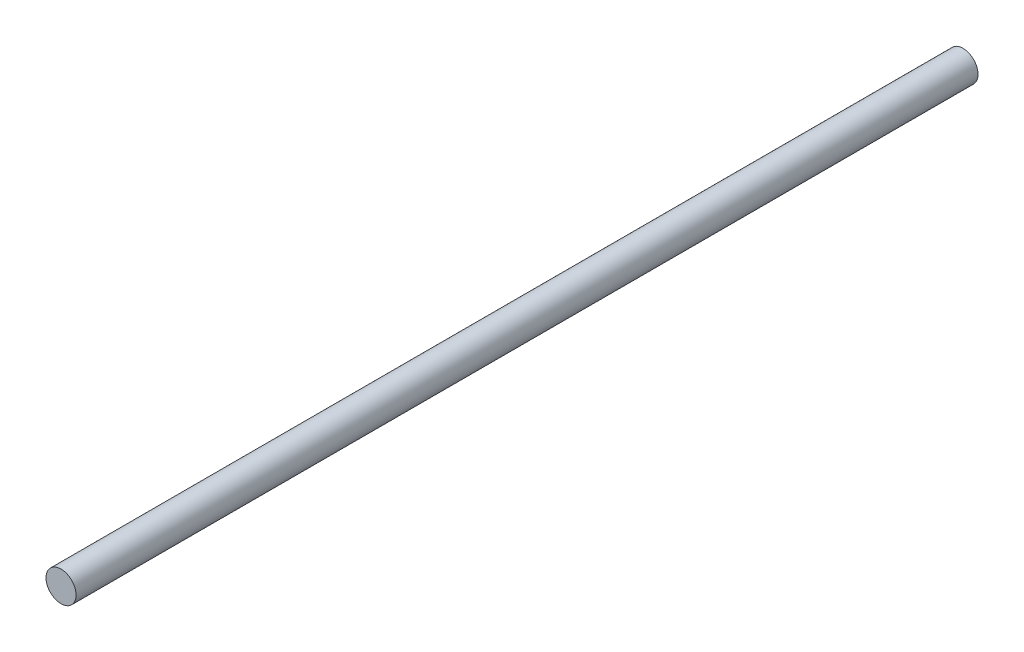
ISO-10303-21;
HEADER;
FILE_DESCRIPTION(('STEP AP214'),'2;1');
FILE_NAME('part.step','',(''),(''),'','','');
FILE_SCHEMA(('AUTOMOTIVE_DESIGN { 1 0 10303 214 1 1 1 1 }'));
ENDSEC;
DATA;
#1=APPLICATION_CONTEXT('core data for automotive mechanical design processes');
#2=APPLICATION_PROTOCOL_DEFINITION('international standard','automotive_design',2000,#1);
#3=PRODUCT_CONTEXT('',#1,'mechanical');
#4=PRODUCT('Part','Part','',(#3));
#5=PRODUCT_RELATED_PRODUCT_CATEGORY('part','',(#4));
#6=PRODUCT_DEFINITION_FORMATION('','',#4);
#7=PRODUCT_DEFINITION_CONTEXT('part definition',#1,'design');
#8=PRODUCT_DEFINITION('design','',#6,#7);
#9=PRODUCT_DEFINITION_SHAPE('','',#8);
#10=(LENGTH_UNIT() NAMED_UNIT(*) SI_UNIT(.MILLI.,.METRE.));
#11=(NAMED_UNIT(*) PLANE_ANGLE_UNIT() SI_UNIT($,.RADIAN.));
#12=(NAMED_UNIT(*) SI_UNIT($,.STERADIAN.) SOLID_ANGLE_UNIT());
#13=UNCERTAINTY_MEASURE_WITH_UNIT(LENGTH_MEASURE(1.E-05),#10,'distance_accuracy_value','');
#14=(GEOMETRIC_REPRESENTATION_CONTEXT(3) GLOBAL_UNCERTAINTY_ASSIGNED_CONTEXT((#13)) GLOBAL_UNIT_ASSIGNED_CONTEXT((#10,
#11,#12)) REPRESENTATION_CONTEXT('',''));
#15=CARTESIAN_POINT('',(0.,0.,0.));
#16=DIRECTION('',(0.,0.,1.));
#17=DIRECTION('',(1.,0.,0.));
#18=AXIS2_PLACEMENT_3D('',#15,#16,#17);
#19=CARTESIAN_POINT('',(0.,0.,90.));
#20=DIRECTION('',(0.,0.,-1.));
#21=DIRECTION('',(-1.,0.,0.));
#22=AXIS2_PLACEMENT_3D('',#19,#20,#21);
#23=CYLINDRICAL_SURFACE('',#22,1.5);
#24=CARTESIAN_POINT('',(0.,0.,90.));
#25=DIRECTION('',(0.,0.,1.));
#26=DIRECTION('',(1.,0.,0.));
#27=AXIS2_PLACEMENT_3D('',#24,#25,#26);
#28=CIRCLE('',#27,1.5);
#29=CARTESIAN_POINT('',(-1.5,0.,90.));
#30=VERTEX_POINT('',#29);
#31=EDGE_CURVE('E10',#30,#30,#28,.T.);
#32=CARTESIAN_POINT('',(0.,0.,0.));
#33=DIRECTION('',(0.,0.,1.));
#34=DIRECTION('',(1.,0.,0.));
#35=AXIS2_PLACEMENT_3D('',#32,#33,#34);
#36=CIRCLE('',#35,1.5);
#37=CARTESIAN_POINT('',(-1.5,0.,0.));
#38=VERTEX_POINT('',#37);
#39=EDGE_CURVE('E34',#38,#38,#36,.T.);
#40=CARTESIAN_POINT('',(-1.5,0.,90.));
#41=CARTESIAN_POINT('',(-1.5,0.,89.0625));
#42=CARTESIAN_POINT('',(-1.5,0.,88.125));
#43=CARTESIAN_POINT('',(-1.5,0.,86.25));
#44=CARTESIAN_POINT('',(-1.5,0.,85.3125));
#45=CARTESIAN_POINT('',(-1.5,0.,83.4375));
#46=CARTESIAN_POINT('',(-1.5,0.,82.5));
#47=CARTESIAN_POINT('',(-1.5,0.,80.625));
#48=CARTESIAN_POINT('',(-1.5,0.,79.6875));
#49=CARTESIAN_POINT('',(-1.5,0.,77.8125));
#50=CARTESIAN_POINT('',(-1.5,0.,76.875));
#51=CARTESIAN_POINT('',(-1.5,0.,75.));
#52=CARTESIAN_POINT('',(-1.5,0.,74.0625));
#53=CARTESIAN_POINT('',(-1.5,0.,72.1875));
#54=CARTESIAN_POINT('',(-1.5,0.,71.25));
#55=CARTESIAN_POINT('',(-1.5,0.,69.375));
#56=CARTESIAN_POINT('',(-1.5,0.,68.4375));
#57=CARTESIAN_POINT('',(-1.5,0.,66.5625));
#58=CARTESIAN_POINT('',(-1.5,0.,65.625));
#59=CARTESIAN_POINT('',(-1.5,0.,63.75));
#60=CARTESIAN_POINT('',(-1.5,0.,62.8125));
#61=CARTESIAN_POINT('',(-1.5,0.,60.9375));
#62=CARTESIAN_POINT('',(-1.5,0.,60.));
#63=CARTESIAN_POINT('',(-1.5,0.,58.125));
#64=CARTESIAN_POINT('',(-1.5,0.,57.1875));
#65=CARTESIAN_POINT('',(-1.5,0.,55.3125));
#66=CARTESIAN_POINT('',(-1.5,0.,54.375));
#67=CARTESIAN_POINT('',(-1.5,0.,52.5));
#68=CARTESIAN_POINT('',(-1.5,0.,51.5625));
#69=CARTESIAN_POINT('',(-1.5,0.,49.6875));
#70=CARTESIAN_POINT('',(-1.5,0.,48.75));
#71=CARTESIAN_POINT('',(-1.5,0.,46.875));
#72=CARTESIAN_POINT('',(-1.5,0.,45.9375));
#73=CARTESIAN_POINT('',(-1.5,0.,44.0625));
#74=CARTESIAN_POINT('',(-1.5,0.,43.125));
#75=CARTESIAN_POINT('',(-1.5,0.,41.25));
#76=CARTESIAN_POINT('',(-1.5,0.,40.3125));
#77=CARTESIAN_POINT('',(-1.5,0.,38.4375));
#78=CARTESIAN_POINT('',(-1.5,0.,37.5));
#79=CARTESIAN_POINT('',(-1.5,0.,35.625));
#80=CARTESIAN_POINT('',(-1.5,0.,34.6875));
#81=CARTESIAN_POINT('',(-1.5,0.,32.8125));
#82=CARTESIAN_POINT('',(-1.5,0.,31.875));
#83=CARTESIAN_POINT('',(-1.5,0.,30.));
#84=CARTESIAN_POINT('',(-1.5,0.,29.0625));
#85=CARTESIAN_POINT('',(-1.5,0.,27.1875));
#86=CARTESIAN_POINT('',(-1.5,0.,26.25));
#87=CARTESIAN_POINT('',(-1.5,0.,24.375));
#88=CARTESIAN_POINT('',(-1.5,0.,23.4375));
#89=CARTESIAN_POINT('',(-1.5,0.,21.5625));
#90=CARTESIAN_POINT('',(-1.5,0.,20.625));
#91=CARTESIAN_POINT('',(-1.5,0.,18.75));
#92=CARTESIAN_POINT('',(-1.5,0.,17.8125));
#93=CARTESIAN_POINT('',(-1.5,0.,15.9375));
#94=CARTESIAN_POINT('',(-1.5,0.,15.));
#95=CARTESIAN_POINT('',(-1.5,0.,13.125));
#96=CARTESIAN_POINT('',(-1.5,0.,12.1875));
#97=CARTESIAN_POINT('',(-1.5,0.,10.3125));
#98=CARTESIAN_POINT('',(-1.5,0.,9.37499999999999));
#99=CARTESIAN_POINT('',(-1.5,0.,7.49999999999999));
#100=CARTESIAN_POINT('',(-1.5,0.,6.56249999999999));
#101=CARTESIAN_POINT('',(-1.5,0.,4.68749999999999));
#102=CARTESIAN_POINT('',(-1.5,0.,3.74999999999998));
#103=CARTESIAN_POINT('',(-1.5,0.,1.87499999999998));
#104=CARTESIAN_POINT('',(-1.5,0.,0.937499999999986));
#105=CARTESIAN_POINT('',(-1.5,0.,0.));
#106=B_SPLINE_CURVE_WITH_KNOTS('',3,(#40,#41,#42,#43,#44,#45,#46,#47,#48,#49,#50,#51,#52,#53,
#54,#55,#56,#57,#58,#59,#60,#61,#62,#63,#64,#65,#66,#67,#68,#69,#70,#71,#72,#73,#74,#75,#76,#77,
#78,#79,#80,#81,#82,#83,#84,#85,#86,#87,#88,#89,#90,#91,#92,#93,#94,#95,#96,#97,#98,#99,#100,
#101,#102,#103,#104,#105),.UNSPECIFIED.,.F.,.F.,(4,2,2,2,2,2,2,2,2,2,2,2,2,2,2,2,2,2,2,2,2,2,2,
2,2,2,2,2,2,2,2,2,4),(0.,2.81250000000001,5.62500000000001,8.43750000000001,11.25,14.0625,
16.875,19.6875,22.5,25.3125,28.125,30.9375,33.75,36.5625,39.375,42.1875,45.,47.8125,50.625,
53.4375,56.25,59.0625,61.875,64.6875,67.5,70.3125,73.125,75.9375,78.75,81.5625,84.375,87.1875,
90.),.UNSPECIFIED.);
#107=EDGE_CURVE('BSEAM31',#30,#38,#106,.T.);
#108=ORIENTED_EDGE('',*,*,#31,.F.);
#109=ORIENTED_EDGE('',*,*,#39,.T.);
#110=ORIENTED_EDGE('',*,*,#107,.T.);
#111=ORIENTED_EDGE('',*,*,#107,.F.);
#112=EDGE_LOOP('',(#108,#110,#109,#111));
#113=FACE_BOUND('',#112,.T.);
#114=ADVANCED_FACE('F31',(#113),#23,.T.);
#115=CARTESIAN_POINT('',(0.,0.,90.));
#116=DIRECTION('',(0.,0.,1.));
#117=DIRECTION('',(1.,0.,0.));
#118=AXIS2_PLACEMENT_3D('',#115,#116,#117);
#119=PLANE('',#118);
#120=ORIENTED_EDGE('',*,*,#31,.T.);
#121=EDGE_LOOP('',(#120));
#122=FACE_BOUND('',#121,.T.);
#123=ADVANCED_FACE('F46',(#122),#119,.T.);
#124=CARTESIAN_POINT('',(0.,0.,0.));
#125=DIRECTION('',(0.,0.,1.));
#126=DIRECTION('',(1.,0.,0.));
#127=AXIS2_PLACEMENT_3D('',#124,#125,#126);
#128=PLANE('',#127);
#129=ORIENTED_EDGE('',*,*,#39,.F.);
#130=EDGE_LOOP('',(#129));
#131=FACE_BOUND('',#130,.T.);
#132=ADVANCED_FACE('F44',(#131),#128,.F.);
#133=CLOSED_SHELL('',(#114,#123,#132));
#134=MANIFOLD_SOLID_BREP('B2',#133);
#135=ADVANCED_BREP_SHAPE_REPRESENTATION('',(#18,#134),#14);
#136=SHAPE_DEFINITION_REPRESENTATION(#9,#135);
ENDSEC;
END-ISO-10303-21;
